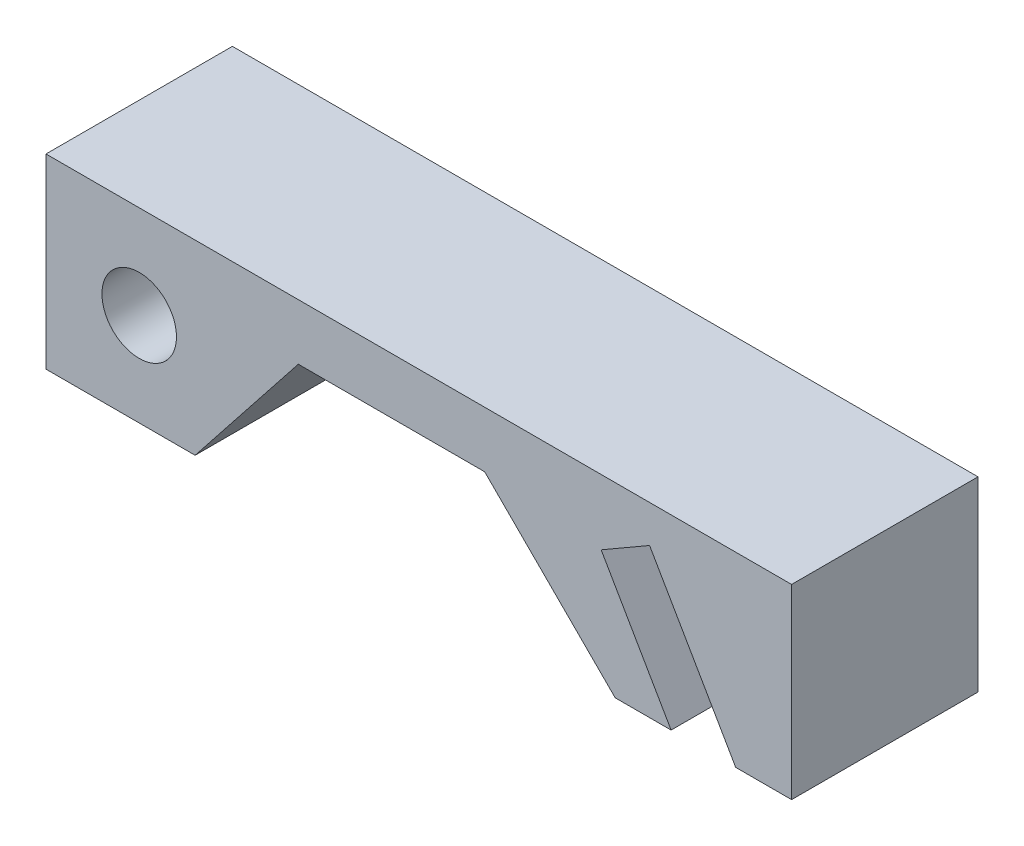
ISO-10303-21;
HEADER;
FILE_DESCRIPTION(('STEP AP214'),'2;1');
FILE_NAME('part.step','',(''),(''),'','','');
FILE_SCHEMA(('AUTOMOTIVE_DESIGN { 1 0 10303 214 1 1 1 1 }'));
ENDSEC;
DATA;
#1=APPLICATION_CONTEXT('core data for automotive mechanical design processes');
#2=APPLICATION_PROTOCOL_DEFINITION('international standard','automotive_design',2000,#1);
#3=PRODUCT_CONTEXT('',#1,'mechanical');
#4=PRODUCT('Part','Part','',(#3));
#5=PRODUCT_RELATED_PRODUCT_CATEGORY('part','',(#4));
#6=PRODUCT_DEFINITION_FORMATION('','',#4);
#7=PRODUCT_DEFINITION_CONTEXT('part definition',#1,'design');
#8=PRODUCT_DEFINITION('design','',#6,#7);
#9=PRODUCT_DEFINITION_SHAPE('','',#8);
#10=(LENGTH_UNIT() NAMED_UNIT(*) SI_UNIT(.MILLI.,.METRE.));
#11=(NAMED_UNIT(*) PLANE_ANGLE_UNIT() SI_UNIT($,.RADIAN.));
#12=(NAMED_UNIT(*) SI_UNIT($,.STERADIAN.) SOLID_ANGLE_UNIT());
#13=UNCERTAINTY_MEASURE_WITH_UNIT(LENGTH_MEASURE(1.E-05),#10,'distance_accuracy_value','');
#14=(GEOMETRIC_REPRESENTATION_CONTEXT(3) GLOBAL_UNCERTAINTY_ASSIGNED_CONTEXT((#13)) GLOBAL_UNIT_ASSIGNED_CONTEXT((#10,
#11,#12)) REPRESENTATION_CONTEXT('',''));
#15=CARTESIAN_POINT('',(0.,0.,0.));
#16=DIRECTION('',(0.,0.,1.));
#17=DIRECTION('',(1.,0.,0.));
#18=AXIS2_PLACEMENT_3D('',#15,#16,#17);
#19=CARTESIAN_POINT('',(0.,0.,6.35));
#20=DIRECTION('',(0.,0.,-1.));
#21=DIRECTION('',(-1.,0.,0.));
#22=AXIS2_PLACEMENT_3D('',#19,#20,#21);
#23=PLANE('',#22);
#24=DIRECTION('',(1.,0.,0.));
#25=VECTOR('',#24,1.);
#26=CARTESIAN_POINT('',(10.16,0.,6.35));
#27=LINE('',#26,#25);
#28=CARTESIAN_POINT('',(0.,0.,6.35));
#29=VERTEX_POINT('',#28);
#30=CARTESIAN_POINT('',(10.16,0.,6.35));
#31=VERTEX_POINT('',#30);
#32=EDGE_CURVE('E185',#29,#31,#27,.T.);
#33=ORIENTED_EDGE('',*,*,#32,.T.);
#34=DIRECTION('',(0.620305538732083,0.784360273482984,0.));
#35=VECTOR('',#34,1.);
#36=CARTESIAN_POINT('',(17.1905909487751,8.89,6.35));
#37=LINE('',#36,#35);
#38=CARTESIAN_POINT('',(17.1905909487751,8.89,6.35));
#39=VERTEX_POINT('',#38);
#40=EDGE_CURVE('E113',#31,#39,#37,.T.);
#41=ORIENTED_EDGE('',*,*,#40,.T.);
#42=DIRECTION('',(1.,0.,0.));
#43=VECTOR('',#42,1.);
#44=CARTESIAN_POINT('',(29.8905909487751,8.89,6.35));
#45=LINE('',#44,#43);
#46=CARTESIAN_POINT('',(29.8905909487751,8.89,6.35));
#47=VERTEX_POINT('',#46);
#48=EDGE_CURVE('E212',#39,#47,#45,.T.);
#49=ORIENTED_EDGE('',*,*,#48,.T.);
#50=DIRECTION('',(0.707106781186546,-0.707106781186549,0.));
#51=VECTOR('',#50,1.);
#52=CARTESIAN_POINT('',(38.780590948775,0.,6.35));
#53=LINE('',#52,#51);
#54=CARTESIAN_POINT('',(38.780590948775,0.,6.35));
#55=VERTEX_POINT('',#54);
#56=EDGE_CURVE('E231',#47,#55,#53,.T.);
#57=ORIENTED_EDGE('',*,*,#56,.T.);
#58=DIRECTION('',(1.,0.,0.));
#59=VECTOR('',#58,1.);
#60=CARTESIAN_POINT('',(42.5905909487751,0.,6.35));
#61=LINE('',#60,#59);
#62=CARTESIAN_POINT('',(42.5905909487751,0.,6.35));
#63=VERTEX_POINT('',#62);
#64=EDGE_CURVE('E228',#55,#63,#61,.T.);
#65=ORIENTED_EDGE('',*,*,#64,.T.);
#66=DIRECTION('',(-0.5,0.866025403784438,0.));
#67=VECTOR('',#66,1.);
#68=CARTESIAN_POINT('',(37.8245644766147,8.25499999999999,6.35));
#69=LINE('',#68,#67);
#70=CARTESIAN_POINT('',(37.8245644766147,8.25499999999999,6.35));
#71=VERTEX_POINT('',#70);
#72=EDGE_CURVE('E230',#63,#71,#69,.T.);
#73=ORIENTED_EDGE('',*,*,#72,.T.);
#74=DIRECTION('',(0.866025403784438,0.500000000000002,0.));
#75=VECTOR('',#74,1.);
#76=CARTESIAN_POINT('',(41.1241212650334,10.16,6.35));
#77=LINE('',#76,#75);
#78=CARTESIAN_POINT('',(41.1241212650334,10.16,6.35));
#79=VERTEX_POINT('',#78);
#80=EDGE_CURVE('E233',#71,#79,#77,.T.);
#81=ORIENTED_EDGE('',*,*,#80,.T.);
#82=DIRECTION('',(0.5,-0.866025403784439,0.));
#83=VECTOR('',#82,1.);
#84=CARTESIAN_POINT('',(46.99,0.,6.35));
#85=LINE('',#84,#83);
#86=CARTESIAN_POINT('',(46.99,0.,6.35));
#87=VERTEX_POINT('',#86);
#88=EDGE_CURVE('E239',#79,#87,#85,.T.);
#89=ORIENTED_EDGE('',*,*,#88,.T.);
#90=DIRECTION('',(1.,0.,0.));
#91=VECTOR('',#90,1.);
#92=CARTESIAN_POINT('',(50.8,0.,6.35));
#93=LINE('',#92,#91);
#94=CARTESIAN_POINT('',(50.8,0.,6.35));
#95=VERTEX_POINT('',#94);
#96=EDGE_CURVE('E144',#87,#95,#93,.T.);
#97=ORIENTED_EDGE('',*,*,#96,.T.);
#98=DIRECTION('',(0.,1.,0.));
#99=VECTOR('',#98,1.);
#100=CARTESIAN_POINT('',(50.8,12.7,6.35));
#101=LINE('',#100,#99);
#102=CARTESIAN_POINT('',(50.8,12.7,6.35));
#103=VERTEX_POINT('',#102);
#104=EDGE_CURVE('E138',#95,#103,#101,.T.);
#105=ORIENTED_EDGE('',*,*,#104,.T.);
#106=DIRECTION('',(-1.,0.,0.));
#107=VECTOR('',#106,1.);
#108=CARTESIAN_POINT('',(0.,12.7,6.35));
#109=LINE('',#108,#107);
#110=CARTESIAN_POINT('',(0.,12.7,6.35));
#111=VERTEX_POINT('',#110);
#112=EDGE_CURVE('E142',#103,#111,#109,.T.);
#113=ORIENTED_EDGE('',*,*,#112,.T.);
#114=DIRECTION('',(0.,-1.,0.));
#115=VECTOR('',#114,1.);
#116=CARTESIAN_POINT('',(0.,0.,6.35));
#117=LINE('',#116,#115);
#118=EDGE_CURVE('E58',#111,#29,#117,.T.);
#119=ORIENTED_EDGE('',*,*,#118,.T.);
#120=EDGE_LOOP('',(#33,#41,#49,#57,#65,#73,#81,#89,#97,#105,#113,#119));
#121=FACE_BOUND('',#120,.T.);
#122=CARTESIAN_POINT('',(6.34999999999997,6.35,6.35));
#123=DIRECTION('',(0.,0.,1.));
#124=DIRECTION('',(1.,0.,0.));
#125=AXIS2_PLACEMENT_3D('',#122,#123,#124);
#126=CIRCLE('',#125,2.54);
#127=CARTESIAN_POINT('',(8.88999999999998,6.35,6.35));
#128=VERTEX_POINT('',#127);
#129=EDGE_CURVE('E166',#128,#128,#126,.T.);
#130=ORIENTED_EDGE('',*,*,#129,.F.);
#131=EDGE_LOOP('',(#130));
#132=FACE_BOUND('',#131,.T.);
#133=ADVANCED_FACE('F41',(#121,#132),#23,.F.);
#134=CARTESIAN_POINT('',(0.,0.,-6.35));
#135=DIRECTION('',(0.,0.,-1.));
#136=DIRECTION('',(-1.,0.,0.));
#137=AXIS2_PLACEMENT_3D('',#134,#135,#136);
#138=PLANE('',#137);
#139=DIRECTION('',(1.,0.,0.));
#140=VECTOR('',#139,1.);
#141=CARTESIAN_POINT('',(10.16,0.,-6.35));
#142=LINE('',#141,#140);
#143=CARTESIAN_POINT('',(0.,0.,-6.35));
#144=VERTEX_POINT('',#143);
#145=CARTESIAN_POINT('',(10.16,0.,-6.35));
#146=VERTEX_POINT('',#145);
#147=EDGE_CURVE('E162',#144,#146,#142,.T.);
#148=ORIENTED_EDGE('',*,*,#147,.F.);
#149=DIRECTION('',(0.,-1.,0.));
#150=VECTOR('',#149,1.);
#151=CARTESIAN_POINT('',(0.,0.,-6.35));
#152=LINE('',#151,#150);
#153=CARTESIAN_POINT('',(0.,12.7,-6.35));
#154=VERTEX_POINT('',#153);
#155=EDGE_CURVE('E105',#154,#144,#152,.T.);
#156=ORIENTED_EDGE('',*,*,#155,.F.);
#157=DIRECTION('',(-1.,0.,0.));
#158=VECTOR('',#157,1.);
#159=CARTESIAN_POINT('',(0.,12.7,-6.35));
#160=LINE('',#159,#158);
#161=CARTESIAN_POINT('',(50.8,12.7,-6.35));
#162=VERTEX_POINT('',#161);
#163=EDGE_CURVE('E99',#162,#154,#160,.T.);
#164=ORIENTED_EDGE('',*,*,#163,.F.);
#165=DIRECTION('',(0.,1.,0.));
#166=VECTOR('',#165,1.);
#167=CARTESIAN_POINT('',(50.8,12.7,-6.35));
#168=LINE('',#167,#166);
#169=CARTESIAN_POINT('',(50.8,0.,-6.35));
#170=VERTEX_POINT('',#169);
#171=EDGE_CURVE('E152',#170,#162,#168,.T.);
#172=ORIENTED_EDGE('',*,*,#171,.F.);
#173=DIRECTION('',(1.,0.,0.));
#174=VECTOR('',#173,1.);
#175=CARTESIAN_POINT('',(50.8,0.,-6.35));
#176=LINE('',#175,#174);
#177=CARTESIAN_POINT('',(46.99,0.,-6.35));
#178=VERTEX_POINT('',#177);
#179=EDGE_CURVE('E180',#178,#170,#176,.T.);
#180=ORIENTED_EDGE('',*,*,#179,.F.);
#181=DIRECTION('',(0.5,-0.866025403784439,0.));
#182=VECTOR('',#181,1.);
#183=CARTESIAN_POINT('',(46.99,0.,-6.35));
#184=LINE('',#183,#182);
#185=CARTESIAN_POINT('',(41.1241212650334,10.16,-6.35));
#186=VERTEX_POINT('',#185);
#187=EDGE_CURVE('E178',#186,#178,#184,.T.);
#188=ORIENTED_EDGE('',*,*,#187,.F.);
#189=DIRECTION('',(0.866025403784438,0.500000000000002,0.));
#190=VECTOR('',#189,1.);
#191=CARTESIAN_POINT('',(41.1241212650334,10.16,-6.35));
#192=LINE('',#191,#190);
#193=CARTESIAN_POINT('',(37.8245644766147,8.25499999999999,-6.35));
#194=VERTEX_POINT('',#193);
#195=EDGE_CURVE('E176',#194,#186,#192,.T.);
#196=ORIENTED_EDGE('',*,*,#195,.F.);
#197=DIRECTION('',(-0.5,0.866025403784438,0.));
#198=VECTOR('',#197,1.);
#199=CARTESIAN_POINT('',(37.8245644766147,8.25499999999999,-6.35));
#200=LINE('',#199,#198);
#201=CARTESIAN_POINT('',(42.5905909487751,0.,-6.35));
#202=VERTEX_POINT('',#201);
#203=EDGE_CURVE('E174',#202,#194,#200,.T.);
#204=ORIENTED_EDGE('',*,*,#203,.F.);
#205=DIRECTION('',(1.,0.,0.));
#206=VECTOR('',#205,1.);
#207=CARTESIAN_POINT('',(42.5905909487751,0.,-6.35));
#208=LINE('',#207,#206);
#209=CARTESIAN_POINT('',(38.780590948775,0.,-6.35));
#210=VERTEX_POINT('',#209);
#211=EDGE_CURVE('E172',#210,#202,#208,.T.);
#212=ORIENTED_EDGE('',*,*,#211,.F.);
#213=DIRECTION('',(0.707106781186546,-0.707106781186549,0.));
#214=VECTOR('',#213,1.);
#215=CARTESIAN_POINT('',(38.780590948775,0.,-6.35));
#216=LINE('',#215,#214);
#217=CARTESIAN_POINT('',(29.8905909487751,8.89,-6.35));
#218=VERTEX_POINT('',#217);
#219=EDGE_CURVE('E170',#218,#210,#216,.T.);
#220=ORIENTED_EDGE('',*,*,#219,.F.);
#221=DIRECTION('',(1.,0.,0.));
#222=VECTOR('',#221,1.);
#223=CARTESIAN_POINT('',(29.8905909487751,8.89,-6.35));
#224=LINE('',#223,#222);
#225=CARTESIAN_POINT('',(17.1905909487751,8.89,-6.35));
#226=VERTEX_POINT('',#225);
#227=EDGE_CURVE('E168',#226,#218,#224,.T.);
#228=ORIENTED_EDGE('',*,*,#227,.F.);
#229=DIRECTION('',(0.620305538732083,0.784360273482984,0.));
#230=VECTOR('',#229,1.);
#231=CARTESIAN_POINT('',(17.1905909487751,8.89,-6.35));
#232=LINE('',#231,#230);
#233=EDGE_CURVE('E165',#146,#226,#232,.T.);
#234=ORIENTED_EDGE('',*,*,#233,.F.);
#235=EDGE_LOOP('',(#148,#156,#164,#172,#180,#188,#196,#204,#212,#220,#228,#234));
#236=FACE_BOUND('',#235,.T.);
#237=CARTESIAN_POINT('',(6.34999999999997,6.35,-6.35));
#238=DIRECTION('',(0.,0.,1.));
#239=DIRECTION('',(1.,0.,0.));
#240=AXIS2_PLACEMENT_3D('',#237,#238,#239);
#241=CIRCLE('',#240,2.54);
#242=CARTESIAN_POINT('',(8.88999999999998,6.35,-6.35));
#243=VERTEX_POINT('',#242);
#244=EDGE_CURVE('E388',#243,#243,#241,.T.);
#245=ORIENTED_EDGE('',*,*,#244,.T.);
#246=EDGE_LOOP('',(#245));
#247=FACE_BOUND('',#246,.T.);
#248=ADVANCED_FACE('F216',(#236,#247),#138,.T.);
#249=CARTESIAN_POINT('',(10.16,0.,6.35));
#250=DIRECTION('',(0.,1.,0.));
#251=DIRECTION('',(-1.,0.,0.));
#252=AXIS2_PLACEMENT_3D('',#249,#250,#251);
#253=PLANE('',#252);
#254=ORIENTED_EDGE('',*,*,#147,.T.);
#255=DIRECTION('',(0.,0.,-1.));
#256=VECTOR('',#255,1.);
#257=CARTESIAN_POINT('',(10.16,0.,6.35));
#258=LINE('',#257,#256);
#259=EDGE_CURVE('E11',#31,#146,#258,.T.);
#260=ORIENTED_EDGE('',*,*,#259,.F.);
#261=ORIENTED_EDGE('',*,*,#32,.F.);
#262=DIRECTION('',(0.,0.,-1.));
#263=VECTOR('',#262,1.);
#264=CARTESIAN_POINT('',(0.,0.,6.35));
#265=LINE('',#264,#263);
#266=EDGE_CURVE('E158',#29,#144,#265,.T.);
#267=ORIENTED_EDGE('',*,*,#266,.T.);
#268=EDGE_LOOP('',(#254,#260,#261,#267));
#269=FACE_BOUND('',#268,.T.);
#270=ADVANCED_FACE('F43',(#269),#253,.F.);
#271=CARTESIAN_POINT('',(17.1905909487751,8.89,6.35));
#272=DIRECTION('',(-0.784360273482984,0.620305538732082,0.));
#273=DIRECTION('',(-0.620305538732083,-0.784360273482984,0.));
#274=AXIS2_PLACEMENT_3D('',#271,#272,#273);
#275=PLANE('',#274);
#276=ORIENTED_EDGE('',*,*,#233,.T.);
#277=DIRECTION('',(0.,0.,-1.));
#278=VECTOR('',#277,1.);
#279=CARTESIAN_POINT('',(17.1905909487751,8.89,6.35));
#280=LINE('',#279,#278);
#281=EDGE_CURVE('E50',#39,#226,#280,.T.);
#282=ORIENTED_EDGE('',*,*,#281,.F.);
#283=ORIENTED_EDGE('',*,*,#40,.F.);
#284=ORIENTED_EDGE('',*,*,#259,.T.);
#285=EDGE_LOOP('',(#276,#282,#283,#284));
#286=FACE_BOUND('',#285,.T.);
#287=ADVANCED_FACE('F273',(#286),#275,.F.);
#288=CARTESIAN_POINT('',(29.8905909487751,8.89,6.35));
#289=DIRECTION('',(0.,1.,0.));
#290=DIRECTION('',(-1.,0.,0.));
#291=AXIS2_PLACEMENT_3D('',#288,#289,#290);
#292=PLANE('',#291);
#293=ORIENTED_EDGE('',*,*,#227,.T.);
#294=DIRECTION('',(0.,0.,-1.));
#295=VECTOR('',#294,1.);
#296=CARTESIAN_POINT('',(29.8905909487751,8.89,6.35));
#297=LINE('',#296,#295);
#298=EDGE_CURVE('E204',#47,#218,#297,.T.);
#299=ORIENTED_EDGE('',*,*,#298,.F.);
#300=ORIENTED_EDGE('',*,*,#48,.F.);
#301=ORIENTED_EDGE('',*,*,#281,.T.);
#302=EDGE_LOOP('',(#293,#299,#300,#301));
#303=FACE_BOUND('',#302,.T.);
#304=ADVANCED_FACE('F210',(#303),#292,.F.);
#305=CARTESIAN_POINT('',(38.780590948775,0.,6.35));
#306=DIRECTION('',(0.707106781186549,0.707106781186546,0.));
#307=DIRECTION('',(-0.707106781186546,0.707106781186549,0.));
#308=AXIS2_PLACEMENT_3D('',#305,#306,#307);
#309=PLANE('',#308);
#310=ORIENTED_EDGE('',*,*,#219,.T.);
#311=DIRECTION('',(0.,0.,-1.));
#312=VECTOR('',#311,1.);
#313=CARTESIAN_POINT('',(38.780590948775,0.,6.35));
#314=LINE('',#313,#312);
#315=EDGE_CURVE('E201',#55,#210,#314,.T.);
#316=ORIENTED_EDGE('',*,*,#315,.F.);
#317=ORIENTED_EDGE('',*,*,#56,.F.);
#318=ORIENTED_EDGE('',*,*,#298,.T.);
#319=EDGE_LOOP('',(#310,#316,#317,#318));
#320=FACE_BOUND('',#319,.T.);
#321=ADVANCED_FACE('F222',(#320),#309,.F.);
#322=CARTESIAN_POINT('',(42.5905909487751,0.,6.35));
#323=DIRECTION('',(0.,1.,0.));
#324=DIRECTION('',(-1.,0.,0.));
#325=AXIS2_PLACEMENT_3D('',#322,#323,#324);
#326=PLANE('',#325);
#327=ORIENTED_EDGE('',*,*,#211,.T.);
#328=DIRECTION('',(0.,0.,-1.));
#329=VECTOR('',#328,1.);
#330=CARTESIAN_POINT('',(42.5905909487751,0.,6.35));
#331=LINE('',#330,#329);
#332=EDGE_CURVE('E198',#63,#202,#331,.T.);
#333=ORIENTED_EDGE('',*,*,#332,.F.);
#334=ORIENTED_EDGE('',*,*,#64,.F.);
#335=ORIENTED_EDGE('',*,*,#315,.T.);
#336=EDGE_LOOP('',(#327,#333,#334,#335));
#337=FACE_BOUND('',#336,.T.);
#338=ADVANCED_FACE('F226',(#337),#326,.F.);
#339=CARTESIAN_POINT('',(37.8245644766147,8.25499999999999,6.35));
#340=DIRECTION('',(-0.866025403784438,-0.5,0.));
#341=DIRECTION('',(0.5,-0.866025403784438,0.));
#342=AXIS2_PLACEMENT_3D('',#339,#340,#341);
#343=PLANE('',#342);
#344=ORIENTED_EDGE('',*,*,#203,.T.);
#345=DIRECTION('',(0.,0.,-1.));
#346=VECTOR('',#345,1.);
#347=CARTESIAN_POINT('',(37.8245644766147,8.25499999999999,6.35));
#348=LINE('',#347,#346);
#349=EDGE_CURVE('E195',#71,#194,#348,.T.);
#350=ORIENTED_EDGE('',*,*,#349,.F.);
#351=ORIENTED_EDGE('',*,*,#72,.F.);
#352=ORIENTED_EDGE('',*,*,#332,.T.);
#353=EDGE_LOOP('',(#344,#350,#351,#352));
#354=FACE_BOUND('',#353,.T.);
#355=ADVANCED_FACE('F286',(#354),#343,.F.);
#356=CARTESIAN_POINT('',(41.1241212650334,10.16,6.35));
#357=DIRECTION('',(-0.500000000000002,0.866025403784438,0.));
#358=DIRECTION('',(-0.866025403784438,-0.500000000000002,0.));
#359=AXIS2_PLACEMENT_3D('',#356,#357,#358);
#360=PLANE('',#359);
#361=ORIENTED_EDGE('',*,*,#195,.T.);
#362=DIRECTION('',(0.,0.,-1.));
#363=VECTOR('',#362,1.);
#364=CARTESIAN_POINT('',(41.1241212650334,10.16,6.35));
#365=LINE('',#364,#363);
#366=EDGE_CURVE('E192',#79,#186,#365,.T.);
#367=ORIENTED_EDGE('',*,*,#366,.F.);
#368=ORIENTED_EDGE('',*,*,#80,.F.);
#369=ORIENTED_EDGE('',*,*,#349,.T.);
#370=EDGE_LOOP('',(#361,#367,#368,#369));
#371=FACE_BOUND('',#370,.T.);
#372=ADVANCED_FACE('F289',(#371),#360,.F.);
#373=CARTESIAN_POINT('',(46.99,0.,6.35));
#374=DIRECTION('',(0.866025403784438,0.5,0.));
#375=DIRECTION('',(-0.5,0.866025403784439,0.));
#376=AXIS2_PLACEMENT_3D('',#373,#374,#375);
#377=PLANE('',#376);
#378=ORIENTED_EDGE('',*,*,#187,.T.);
#379=DIRECTION('',(0.,0.,-1.));
#380=VECTOR('',#379,1.);
#381=CARTESIAN_POINT('',(46.99,0.,6.35));
#382=LINE('',#381,#380);
#383=EDGE_CURVE('E189',#87,#178,#382,.T.);
#384=ORIENTED_EDGE('',*,*,#383,.F.);
#385=ORIENTED_EDGE('',*,*,#88,.F.);
#386=ORIENTED_EDGE('',*,*,#366,.T.);
#387=EDGE_LOOP('',(#378,#384,#385,#386));
#388=FACE_BOUND('',#387,.T.);
#389=ADVANCED_FACE('F245',(#388),#377,.F.);
#390=CARTESIAN_POINT('',(50.8,0.,6.35));
#391=DIRECTION('',(0.,1.,0.));
#392=DIRECTION('',(-1.,0.,0.));
#393=AXIS2_PLACEMENT_3D('',#390,#391,#392);
#394=PLANE('',#393);
#395=ORIENTED_EDGE('',*,*,#179,.T.);
#396=DIRECTION('',(0.,0.,-1.));
#397=VECTOR('',#396,1.);
#398=CARTESIAN_POINT('',(50.8,0.,6.35));
#399=LINE('',#398,#397);
#400=EDGE_CURVE('E153',#95,#170,#399,.T.);
#401=ORIENTED_EDGE('',*,*,#400,.F.);
#402=ORIENTED_EDGE('',*,*,#96,.F.);
#403=ORIENTED_EDGE('',*,*,#383,.T.);
#404=EDGE_LOOP('',(#395,#401,#402,#403));
#405=FACE_BOUND('',#404,.T.);
#406=ADVANCED_FACE('F249',(#405),#394,.F.);
#407=CARTESIAN_POINT('',(50.8,12.7,6.35));
#408=DIRECTION('',(-1.,0.,0.));
#409=DIRECTION('',(0.,0.,1.));
#410=AXIS2_PLACEMENT_3D('',#407,#408,#409);
#411=PLANE('',#410);
#412=ORIENTED_EDGE('',*,*,#171,.T.);
#413=DIRECTION('',(0.,0.,-1.));
#414=VECTOR('',#413,1.);
#415=CARTESIAN_POINT('',(50.8,12.7,6.35));
#416=LINE('',#415,#414);
#417=EDGE_CURVE('E149',#103,#162,#416,.T.);
#418=ORIENTED_EDGE('',*,*,#417,.F.);
#419=ORIENTED_EDGE('',*,*,#104,.F.);
#420=ORIENTED_EDGE('',*,*,#400,.T.);
#421=EDGE_LOOP('',(#412,#418,#419,#420));
#422=FACE_BOUND('',#421,.T.);
#423=ADVANCED_FACE('F150',(#422),#411,.F.);
#424=CARTESIAN_POINT('',(0.,12.7,6.35));
#425=DIRECTION('',(0.,-1.,0.));
#426=DIRECTION('',(0.,0.,-1.));
#427=AXIS2_PLACEMENT_3D('',#424,#425,#426);
#428=PLANE('',#427);
#429=ORIENTED_EDGE('',*,*,#163,.T.);
#430=DIRECTION('',(0.,0.,-1.));
#431=VECTOR('',#430,1.);
#432=CARTESIAN_POINT('',(0.,12.7,6.35));
#433=LINE('',#432,#431);
#434=EDGE_CURVE('E154',#111,#154,#433,.T.);
#435=ORIENTED_EDGE('',*,*,#434,.F.);
#436=ORIENTED_EDGE('',*,*,#112,.F.);
#437=ORIENTED_EDGE('',*,*,#417,.T.);
#438=EDGE_LOOP('',(#429,#435,#436,#437));
#439=FACE_BOUND('',#438,.T.);
#440=ADVANCED_FACE('F156',(#439),#428,.F.);
#441=CARTESIAN_POINT('',(0.,0.,6.35));
#442=DIRECTION('',(1.,0.,0.));
#443=DIRECTION('',(0.,0.,-1.));
#444=AXIS2_PLACEMENT_3D('',#441,#442,#443);
#445=PLANE('',#444);
#446=ORIENTED_EDGE('',*,*,#155,.T.);
#447=ORIENTED_EDGE('',*,*,#266,.F.);
#448=ORIENTED_EDGE('',*,*,#118,.F.);
#449=ORIENTED_EDGE('',*,*,#434,.T.);
#450=EDGE_LOOP('',(#446,#447,#448,#449));
#451=FACE_BOUND('',#450,.T.);
#452=ADVANCED_FACE('F253',(#451),#445,.F.);
#453=CARTESIAN_POINT('',(6.34999999999997,6.35,6.35));
#454=DIRECTION('',(0.,0.,-1.));
#455=DIRECTION('',(-1.,0.,0.));
#456=AXIS2_PLACEMENT_3D('',#453,#454,#455);
#457=CYLINDRICAL_SURFACE('',#456,2.54);
#458=ORIENTED_EDGE('',*,*,#129,.T.);
#459=EDGE_LOOP('',(#458));
#460=FACE_BOUND('',#459,.T.);
#461=ORIENTED_EDGE('',*,*,#244,.F.);
#462=EDGE_LOOP('',(#461));
#463=FACE_BOUND('',#462,.T.);
#464=ADVANCED_FACE('F255',(#460,#463),#457,.F.);
#465=CLOSED_SHELL('',(#133,#248,#270,#287,#304,#321,#338,#355,#372,#389,#406,#423,#440,#452,#464));
#466=MANIFOLD_SOLID_BREP('B2',#465);
#467=ADVANCED_BREP_SHAPE_REPRESENTATION('',(#18,#466),#14);
#468=SHAPE_DEFINITION_REPRESENTATION(#9,#467);
ENDSEC;
END-ISO-10303-21;
